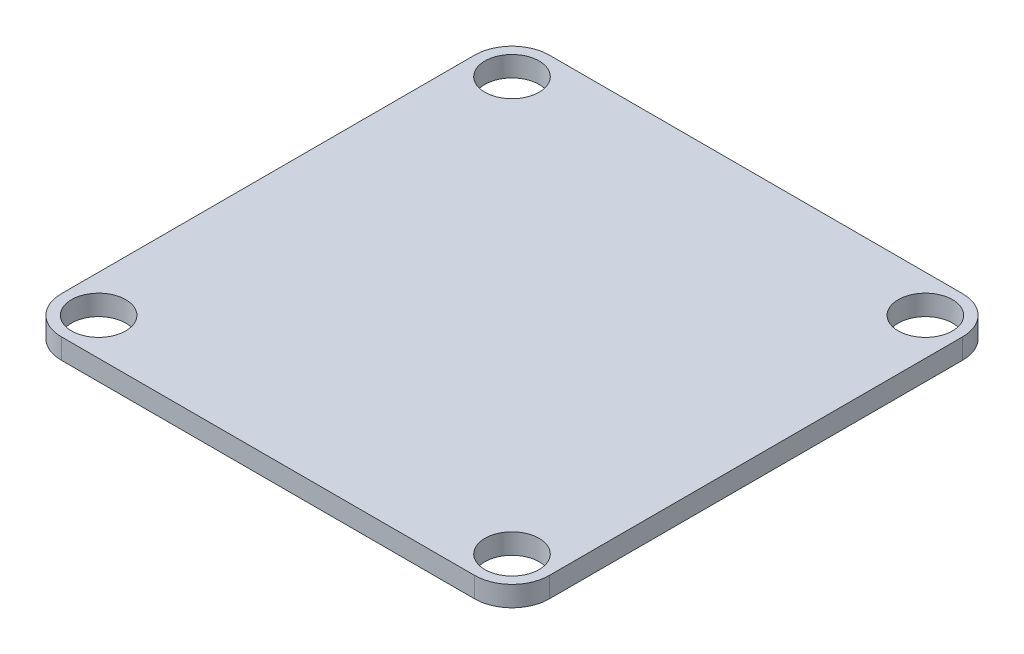
ISO-10303-21;
HEADER;
FILE_DESCRIPTION(('STEP AP214'),'2;1');
FILE_NAME('part.step','',(''),(''),'','','');
FILE_SCHEMA(('AUTOMOTIVE_DESIGN { 1 0 10303 214 1 1 1 1 }'));
ENDSEC;
DATA;
#1=APPLICATION_CONTEXT('core data for automotive mechanical design processes');
#2=APPLICATION_PROTOCOL_DEFINITION('international standard','automotive_design',2000,#1);
#3=PRODUCT_CONTEXT('',#1,'mechanical');
#4=PRODUCT('Part','Part','',(#3));
#5=PRODUCT_RELATED_PRODUCT_CATEGORY('part','',(#4));
#6=PRODUCT_DEFINITION_FORMATION('','',#4);
#7=PRODUCT_DEFINITION_CONTEXT('part definition',#1,'design');
#8=PRODUCT_DEFINITION('design','',#6,#7);
#9=PRODUCT_DEFINITION_SHAPE('','',#8);
#10=(LENGTH_UNIT() NAMED_UNIT(*) SI_UNIT(.MILLI.,.METRE.));
#11=(NAMED_UNIT(*) PLANE_ANGLE_UNIT() SI_UNIT($,.RADIAN.));
#12=(NAMED_UNIT(*) SI_UNIT($,.STERADIAN.) SOLID_ANGLE_UNIT());
#13=UNCERTAINTY_MEASURE_WITH_UNIT(LENGTH_MEASURE(1.E-05),#10,'distance_accuracy_value','');
#14=(GEOMETRIC_REPRESENTATION_CONTEXT(3) GLOBAL_UNCERTAINTY_ASSIGNED_CONTEXT((#13)) GLOBAL_UNIT_ASSIGNED_CONTEXT((#10,
#11,#12)) REPRESENTATION_CONTEXT('',''));
#15=CARTESIAN_POINT('',(0.,0.,0.));
#16=DIRECTION('',(0.,0.,1.));
#17=DIRECTION('',(1.,0.,0.));
#18=AXIS2_PLACEMENT_3D('',#15,#16,#17);
#19=CARTESIAN_POINT('',(15.25,1.5,15.25));
#20=DIRECTION('',(0.,1.,0.));
#21=DIRECTION('',(0.,0.,1.));
#22=AXIS2_PLACEMENT_3D('',#19,#20,#21);
#23=PLANE('',#22);
#24=CARTESIAN_POINT('',(-15.25,1.5,15.25));
#25=DIRECTION('',(0.,1.,0.));
#26=DIRECTION('',(0.,0.,1.));
#27=AXIS2_PLACEMENT_3D('',#24,#25,#26);
#28=CIRCLE('',#27,2.);
#29=CARTESIAN_POINT('',(-15.25,1.5,17.25));
#30=VERTEX_POINT('',#29);
#31=EDGE_CURVE('E193',#30,#30,#28,.T.);
#32=ORIENTED_EDGE('',*,*,#31,.F.);
#33=EDGE_LOOP('',(#32));
#34=FACE_BOUND('',#33,.T.);
#35=CARTESIAN_POINT('',(15.25,1.5,-15.25));
#36=DIRECTION('',(0.,1.,0.));
#37=DIRECTION('',(0.,0.,1.));
#38=AXIS2_PLACEMENT_3D('',#35,#36,#37);
#39=CIRCLE('',#38,2.);
#40=CARTESIAN_POINT('',(15.25,1.5,-13.25));
#41=VERTEX_POINT('',#40);
#42=EDGE_CURVE('E139',#41,#41,#39,.T.);
#43=ORIENTED_EDGE('',*,*,#42,.F.);
#44=EDGE_LOOP('',(#43));
#45=FACE_BOUND('',#44,.T.);
#46=CARTESIAN_POINT('',(15.25,1.5,15.25));
#47=DIRECTION('',(0.,1.,0.));
#48=DIRECTION('',(0.,0.,1.));
#49=AXIS2_PLACEMENT_3D('',#46,#47,#48);
#50=CIRCLE('',#49,2.75);
#51=CARTESIAN_POINT('',(15.25,1.5,18.));
#52=VERTEX_POINT('',#51);
#53=CARTESIAN_POINT('',(18.,1.5,15.25));
#54=VERTEX_POINT('',#53);
#55=EDGE_CURVE('E150',#52,#54,#50,.T.);
#56=ORIENTED_EDGE('',*,*,#55,.T.);
#57=DIRECTION('',(0.,0.,-1.));
#58=VECTOR('',#57,1.);
#59=CARTESIAN_POINT('',(18.,1.5,15.25));
#60=LINE('',#59,#58);
#61=CARTESIAN_POINT('',(18.,1.5,-15.25));
#62=VERTEX_POINT('',#61);
#63=EDGE_CURVE('E98',#54,#62,#60,.T.);
#64=ORIENTED_EDGE('',*,*,#63,.T.);
#65=CARTESIAN_POINT('',(15.25,1.5,-15.25));
#66=DIRECTION('',(0.,1.,0.));
#67=DIRECTION('',(0.,0.,-1.));
#68=AXIS2_PLACEMENT_3D('',#65,#66,#67);
#69=CIRCLE('',#68,2.75);
#70=CARTESIAN_POINT('',(15.25,1.5,-18.));
#71=VERTEX_POINT('',#70);
#72=EDGE_CURVE('E165',#62,#71,#69,.T.);
#73=ORIENTED_EDGE('',*,*,#72,.T.);
#74=DIRECTION('',(-1.,0.,0.));
#75=VECTOR('',#74,1.);
#76=CARTESIAN_POINT('',(-15.25,1.5,-18.));
#77=LINE('',#76,#75);
#78=CARTESIAN_POINT('',(-15.25,1.5,-18.));
#79=VERTEX_POINT('',#78);
#80=EDGE_CURVE('E178',#71,#79,#77,.T.);
#81=ORIENTED_EDGE('',*,*,#80,.T.);
#82=CARTESIAN_POINT('',(-15.25,1.5,-15.25));
#83=DIRECTION('',(0.,1.,0.));
#84=DIRECTION('',(0.,0.,-1.));
#85=AXIS2_PLACEMENT_3D('',#82,#83,#84);
#86=CIRCLE('',#85,2.75);
#87=CARTESIAN_POINT('',(-18.,1.5,-15.25));
#88=VERTEX_POINT('',#87);
#89=EDGE_CURVE('E117',#79,#88,#86,.T.);
#90=ORIENTED_EDGE('',*,*,#89,.T.);
#91=DIRECTION('',(0.,0.,1.));
#92=VECTOR('',#91,1.);
#93=CARTESIAN_POINT('',(-18.,1.5,15.25));
#94=LINE('',#93,#92);
#95=CARTESIAN_POINT('',(-18.,1.5,15.25));
#96=VERTEX_POINT('',#95);
#97=EDGE_CURVE('E111',#88,#96,#94,.T.);
#98=ORIENTED_EDGE('',*,*,#97,.T.);
#99=CARTESIAN_POINT('',(-15.25,1.5,15.25));
#100=DIRECTION('',(0.,1.,0.));
#101=DIRECTION('',(0.,0.,-1.));
#102=AXIS2_PLACEMENT_3D('',#99,#100,#101);
#103=CIRCLE('',#102,2.75);
#104=CARTESIAN_POINT('',(-15.25,1.5,18.));
#105=VERTEX_POINT('',#104);
#106=EDGE_CURVE('E115',#96,#105,#103,.T.);
#107=ORIENTED_EDGE('',*,*,#106,.T.);
#108=DIRECTION('',(1.,0.,0.));
#109=VECTOR('',#108,1.);
#110=CARTESIAN_POINT('',(-15.25,1.5,18.));
#111=LINE('',#110,#109);
#112=EDGE_CURVE('E55',#105,#52,#111,.T.);
#113=ORIENTED_EDGE('',*,*,#112,.T.);
#114=EDGE_LOOP('',(#56,#64,#73,#81,#90,#98,#107,#113));
#115=FACE_BOUND('',#114,.T.);
#116=CARTESIAN_POINT('',(15.25,1.5,15.25));
#117=DIRECTION('',(0.,1.,0.));
#118=DIRECTION('',(0.,0.,1.));
#119=AXIS2_PLACEMENT_3D('',#116,#117,#118);
#120=CIRCLE('',#119,2.);
#121=CARTESIAN_POINT('',(15.25,1.5,17.25));
#122=VERTEX_POINT('',#121);
#123=EDGE_CURVE('E187',#122,#122,#120,.T.);
#124=ORIENTED_EDGE('',*,*,#123,.F.);
#125=EDGE_LOOP('',(#124));
#126=FACE_BOUND('',#125,.T.);
#127=CARTESIAN_POINT('',(-15.25,1.5,-15.25));
#128=DIRECTION('',(0.,1.,0.));
#129=DIRECTION('',(0.,0.,1.));
#130=AXIS2_PLACEMENT_3D('',#127,#128,#129);
#131=CIRCLE('',#130,2.);
#132=CARTESIAN_POINT('',(-15.25,1.5,-13.25));
#133=VERTEX_POINT('',#132);
#134=EDGE_CURVE('E199',#133,#133,#131,.T.);
#135=ORIENTED_EDGE('',*,*,#134,.F.);
#136=EDGE_LOOP('',(#135));
#137=FACE_BOUND('',#136,.T.);
#138=ADVANCED_FACE('F38',(#34,#45,#115,#126,#137),#23,.T.);
#139=CARTESIAN_POINT('',(15.25,0.,15.25));
#140=DIRECTION('',(0.,1.,0.));
#141=DIRECTION('',(0.,0.,1.));
#142=AXIS2_PLACEMENT_3D('',#139,#140,#141);
#143=PLANE('',#142);
#144=CARTESIAN_POINT('',(15.25,0.,15.25));
#145=DIRECTION('',(0.,1.,0.));
#146=DIRECTION('',(0.,0.,1.));
#147=AXIS2_PLACEMENT_3D('',#144,#145,#146);
#148=CIRCLE('',#147,2.75);
#149=CARTESIAN_POINT('',(15.25,0.,18.));
#150=VERTEX_POINT('',#149);
#151=CARTESIAN_POINT('',(18.,0.,15.25));
#152=VERTEX_POINT('',#151);
#153=EDGE_CURVE('E135',#150,#152,#148,.T.);
#154=ORIENTED_EDGE('',*,*,#153,.F.);
#155=DIRECTION('',(1.,0.,0.));
#156=VECTOR('',#155,1.);
#157=CARTESIAN_POINT('',(-15.25,0.,18.));
#158=LINE('',#157,#156);
#159=CARTESIAN_POINT('',(-15.25,0.,18.));
#160=VERTEX_POINT('',#159);
#161=EDGE_CURVE('E90',#160,#150,#158,.T.);
#162=ORIENTED_EDGE('',*,*,#161,.F.);
#163=CARTESIAN_POINT('',(-15.25,0.,15.25));
#164=DIRECTION('',(0.,1.,0.));
#165=DIRECTION('',(0.,0.,-1.));
#166=AXIS2_PLACEMENT_3D('',#163,#164,#165);
#167=CIRCLE('',#166,2.75);
#168=CARTESIAN_POINT('',(-18.,0.,15.25));
#169=VERTEX_POINT('',#168);
#170=EDGE_CURVE('E84',#169,#160,#167,.T.);
#171=ORIENTED_EDGE('',*,*,#170,.F.);
#172=DIRECTION('',(0.,0.,1.));
#173=VECTOR('',#172,1.);
#174=CARTESIAN_POINT('',(-18.,0.,15.25));
#175=LINE('',#174,#173);
#176=CARTESIAN_POINT('',(-18.,0.,-15.25));
#177=VERTEX_POINT('',#176);
#178=EDGE_CURVE('E125',#177,#169,#175,.T.);
#179=ORIENTED_EDGE('',*,*,#178,.F.);
#180=CARTESIAN_POINT('',(-15.25,0.,-15.25));
#181=DIRECTION('',(0.,1.,0.));
#182=DIRECTION('',(0.,0.,-1.));
#183=AXIS2_PLACEMENT_3D('',#180,#181,#182);
#184=CIRCLE('',#183,2.75);
#185=CARTESIAN_POINT('',(-15.25,0.,-18.));
#186=VERTEX_POINT('',#185);
#187=EDGE_CURVE('E145',#186,#177,#184,.T.);
#188=ORIENTED_EDGE('',*,*,#187,.F.);
#189=DIRECTION('',(-1.,0.,0.));
#190=VECTOR('',#189,1.);
#191=CARTESIAN_POINT('',(-15.25,0.,-18.));
#192=LINE('',#191,#190);
#193=CARTESIAN_POINT('',(15.25,0.,-18.));
#194=VERTEX_POINT('',#193);
#195=EDGE_CURVE('E143',#194,#186,#192,.T.);
#196=ORIENTED_EDGE('',*,*,#195,.F.);
#197=CARTESIAN_POINT('',(15.25,0.,-15.25));
#198=DIRECTION('',(0.,1.,0.));
#199=DIRECTION('',(0.,0.,-1.));
#200=AXIS2_PLACEMENT_3D('',#197,#198,#199);
#201=CIRCLE('',#200,2.75);
#202=CARTESIAN_POINT('',(18.,0.,-15.25));
#203=VERTEX_POINT('',#202);
#204=EDGE_CURVE('E141',#203,#194,#201,.T.);
#205=ORIENTED_EDGE('',*,*,#204,.F.);
#206=DIRECTION('',(0.,0.,-1.));
#207=VECTOR('',#206,1.);
#208=CARTESIAN_POINT('',(18.,0.,15.25));
#209=LINE('',#208,#207);
#210=EDGE_CURVE('E138',#152,#203,#209,.T.);
#211=ORIENTED_EDGE('',*,*,#210,.F.);
#212=EDGE_LOOP('',(#154,#162,#171,#179,#188,#196,#205,#211));
#213=FACE_BOUND('',#212,.T.);
#214=CARTESIAN_POINT('',(15.25,0.,-15.25));
#215=DIRECTION('',(0.,1.,0.));
#216=DIRECTION('',(0.,0.,1.));
#217=AXIS2_PLACEMENT_3D('',#214,#215,#216);
#218=CIRCLE('',#217,2.);
#219=CARTESIAN_POINT('',(15.25,0.,-13.25));
#220=VERTEX_POINT('',#219);
#221=EDGE_CURVE('E184',#220,#220,#218,.T.);
#222=ORIENTED_EDGE('',*,*,#221,.T.);
#223=EDGE_LOOP('',(#222));
#224=FACE_BOUND('',#223,.T.);
#225=CARTESIAN_POINT('',(15.25,0.,15.25));
#226=DIRECTION('',(0.,1.,0.));
#227=DIRECTION('',(0.,0.,1.));
#228=AXIS2_PLACEMENT_3D('',#225,#226,#227);
#229=CIRCLE('',#228,2.);
#230=CARTESIAN_POINT('',(15.25,0.,17.25));
#231=VERTEX_POINT('',#230);
#232=EDGE_CURVE('E190',#231,#231,#229,.T.);
#233=ORIENTED_EDGE('',*,*,#232,.T.);
#234=EDGE_LOOP('',(#233));
#235=FACE_BOUND('',#234,.T.);
#236=CARTESIAN_POINT('',(-15.25,0.,15.25));
#237=DIRECTION('',(0.,1.,0.));
#238=DIRECTION('',(0.,0.,1.));
#239=AXIS2_PLACEMENT_3D('',#236,#237,#238);
#240=CIRCLE('',#239,2.);
#241=CARTESIAN_POINT('',(-15.25,0.,17.25));
#242=VERTEX_POINT('',#241);
#243=EDGE_CURVE('E196',#242,#242,#240,.T.);
#244=ORIENTED_EDGE('',*,*,#243,.T.);
#245=EDGE_LOOP('',(#244));
#246=FACE_BOUND('',#245,.T.);
#247=CARTESIAN_POINT('',(-15.25,0.,-15.25));
#248=DIRECTION('',(0.,1.,0.));
#249=DIRECTION('',(0.,0.,1.));
#250=AXIS2_PLACEMENT_3D('',#247,#248,#249);
#251=CIRCLE('',#250,2.);
#252=CARTESIAN_POINT('',(-15.25,0.,-13.25));
#253=VERTEX_POINT('',#252);
#254=EDGE_CURVE('E202',#253,#253,#251,.T.);
#255=ORIENTED_EDGE('',*,*,#254,.T.);
#256=EDGE_LOOP('',(#255));
#257=FACE_BOUND('',#256,.T.);
#258=ADVANCED_FACE('F169',(#213,#224,#235,#246,#257),#143,.F.);
#259=CARTESIAN_POINT('',(15.25,1.5,15.25));
#260=DIRECTION('',(0.,-1.,0.));
#261=DIRECTION('',(0.,0.,-1.));
#262=AXIS2_PLACEMENT_3D('',#259,#260,#261);
#263=CYLINDRICAL_SURFACE('',#262,2.75);
#264=ORIENTED_EDGE('',*,*,#153,.T.);
#265=DIRECTION('',(0.,-1.,0.));
#266=VECTOR('',#265,1.);
#267=CARTESIAN_POINT('',(18.,1.5,15.25));
#268=LINE('',#267,#266);
#269=EDGE_CURVE('E11',#54,#152,#268,.T.);
#270=ORIENTED_EDGE('',*,*,#269,.F.);
#271=ORIENTED_EDGE('',*,*,#55,.F.);
#272=DIRECTION('',(0.,-1.,0.));
#273=VECTOR('',#272,1.);
#274=CARTESIAN_POINT('',(15.25,1.5,18.));
#275=LINE('',#274,#273);
#276=EDGE_CURVE('E131',#52,#150,#275,.T.);
#277=ORIENTED_EDGE('',*,*,#276,.T.);
#278=EDGE_LOOP('',(#264,#270,#271,#277));
#279=FACE_BOUND('',#278,.T.);
#280=ADVANCED_FACE('F40',(#279),#263,.T.);
#281=CARTESIAN_POINT('',(18.,1.5,15.25));
#282=DIRECTION('',(-1.,0.,0.));
#283=DIRECTION('',(0.,0.,1.));
#284=AXIS2_PLACEMENT_3D('',#281,#282,#283);
#285=PLANE('',#284);
#286=ORIENTED_EDGE('',*,*,#210,.T.);
#287=DIRECTION('',(0.,-1.,0.));
#288=VECTOR('',#287,1.);
#289=CARTESIAN_POINT('',(18.,1.5,-15.25));
#290=LINE('',#289,#288);
#291=EDGE_CURVE('E47',#62,#203,#290,.T.);
#292=ORIENTED_EDGE('',*,*,#291,.F.);
#293=ORIENTED_EDGE('',*,*,#63,.F.);
#294=ORIENTED_EDGE('',*,*,#269,.T.);
#295=EDGE_LOOP('',(#286,#292,#293,#294));
#296=FACE_BOUND('',#295,.T.);
#297=ADVANCED_FACE('F236',(#296),#285,.F.);
#298=CARTESIAN_POINT('',(15.25,1.5,-15.25));
#299=DIRECTION('',(0.,-1.,0.));
#300=DIRECTION('',(0.,0.,-1.));
#301=AXIS2_PLACEMENT_3D('',#298,#299,#300);
#302=CYLINDRICAL_SURFACE('',#301,2.75);
#303=ORIENTED_EDGE('',*,*,#204,.T.);
#304=DIRECTION('',(0.,-1.,0.));
#305=VECTOR('',#304,1.);
#306=CARTESIAN_POINT('',(15.25,1.5,-18.));
#307=LINE('',#306,#305);
#308=EDGE_CURVE('E157',#71,#194,#307,.T.);
#309=ORIENTED_EDGE('',*,*,#308,.F.);
#310=ORIENTED_EDGE('',*,*,#72,.F.);
#311=ORIENTED_EDGE('',*,*,#291,.T.);
#312=EDGE_LOOP('',(#303,#309,#310,#311));
#313=FACE_BOUND('',#312,.T.);
#314=ADVANCED_FACE('F163',(#313),#302,.T.);
#315=CARTESIAN_POINT('',(-15.25,1.5,-18.));
#316=DIRECTION('',(0.,0.,1.));
#317=DIRECTION('',(1.,0.,0.));
#318=AXIS2_PLACEMENT_3D('',#315,#316,#317);
#319=PLANE('',#318);
#320=ORIENTED_EDGE('',*,*,#195,.T.);
#321=DIRECTION('',(0.,-1.,0.));
#322=VECTOR('',#321,1.);
#323=CARTESIAN_POINT('',(-15.25,1.5,-18.));
#324=LINE('',#323,#322);
#325=EDGE_CURVE('E154',#79,#186,#324,.T.);
#326=ORIENTED_EDGE('',*,*,#325,.F.);
#327=ORIENTED_EDGE('',*,*,#80,.F.);
#328=ORIENTED_EDGE('',*,*,#308,.T.);
#329=EDGE_LOOP('',(#320,#326,#327,#328));
#330=FACE_BOUND('',#329,.T.);
#331=ADVANCED_FACE('F174',(#330),#319,.F.);
#332=CARTESIAN_POINT('',(-15.25,1.5,-15.25));
#333=DIRECTION('',(0.,-1.,0.));
#334=DIRECTION('',(0.,0.,-1.));
#335=AXIS2_PLACEMENT_3D('',#332,#333,#334);
#336=CYLINDRICAL_SURFACE('',#335,2.75);
#337=ORIENTED_EDGE('',*,*,#187,.T.);
#338=DIRECTION('',(0.,-1.,0.));
#339=VECTOR('',#338,1.);
#340=CARTESIAN_POINT('',(-18.,1.5,-15.25));
#341=LINE('',#340,#339);
#342=EDGE_CURVE('E126',#88,#177,#341,.T.);
#343=ORIENTED_EDGE('',*,*,#342,.F.);
#344=ORIENTED_EDGE('',*,*,#89,.F.);
#345=ORIENTED_EDGE('',*,*,#325,.T.);
#346=EDGE_LOOP('',(#337,#343,#344,#345));
#347=FACE_BOUND('',#346,.T.);
#348=ADVANCED_FACE('F177',(#347),#336,.T.);
#349=CARTESIAN_POINT('',(-18.,1.5,15.25));
#350=DIRECTION('',(1.,0.,0.));
#351=DIRECTION('',(0.,0.,-1.));
#352=AXIS2_PLACEMENT_3D('',#349,#350,#351);
#353=PLANE('',#352);
#354=ORIENTED_EDGE('',*,*,#178,.T.);
#355=DIRECTION('',(0.,-1.,0.));
#356=VECTOR('',#355,1.);
#357=CARTESIAN_POINT('',(-18.,1.5,15.25));
#358=LINE('',#357,#356);
#359=EDGE_CURVE('E122',#96,#169,#358,.T.);
#360=ORIENTED_EDGE('',*,*,#359,.F.);
#361=ORIENTED_EDGE('',*,*,#97,.F.);
#362=ORIENTED_EDGE('',*,*,#342,.T.);
#363=EDGE_LOOP('',(#354,#360,#361,#362));
#364=FACE_BOUND('',#363,.T.);
#365=ADVANCED_FACE('F123',(#364),#353,.F.);
#366=CARTESIAN_POINT('',(-15.25,1.5,15.25));
#367=DIRECTION('',(0.,-1.,0.));
#368=DIRECTION('',(0.,0.,-1.));
#369=AXIS2_PLACEMENT_3D('',#366,#367,#368);
#370=CYLINDRICAL_SURFACE('',#369,2.75);
#371=ORIENTED_EDGE('',*,*,#170,.T.);
#372=DIRECTION('',(0.,-1.,0.));
#373=VECTOR('',#372,1.);
#374=CARTESIAN_POINT('',(-15.25,1.5,18.));
#375=LINE('',#374,#373);
#376=EDGE_CURVE('E127',#105,#160,#375,.T.);
#377=ORIENTED_EDGE('',*,*,#376,.F.);
#378=ORIENTED_EDGE('',*,*,#106,.F.);
#379=ORIENTED_EDGE('',*,*,#359,.T.);
#380=EDGE_LOOP('',(#371,#377,#378,#379));
#381=FACE_BOUND('',#380,.T.);
#382=ADVANCED_FACE('F129',(#381),#370,.T.);
#383=CARTESIAN_POINT('',(-15.25,1.5,18.));
#384=DIRECTION('',(0.,0.,-1.));
#385=DIRECTION('',(-1.,0.,0.));
#386=AXIS2_PLACEMENT_3D('',#383,#384,#385);
#387=PLANE('',#386);
#388=ORIENTED_EDGE('',*,*,#161,.T.);
#389=ORIENTED_EDGE('',*,*,#276,.F.);
#390=ORIENTED_EDGE('',*,*,#112,.F.);
#391=ORIENTED_EDGE('',*,*,#376,.T.);
#392=EDGE_LOOP('',(#388,#389,#390,#391));
#393=FACE_BOUND('',#392,.T.);
#394=ADVANCED_FACE('F224',(#393),#387,.F.);
#395=CARTESIAN_POINT('',(15.25,1.5,-15.25));
#396=DIRECTION('',(0.,-1.,0.));
#397=DIRECTION('',(0.,0.,-1.));
#398=AXIS2_PLACEMENT_3D('',#395,#396,#397);
#399=CYLINDRICAL_SURFACE('',#398,2.);
#400=ORIENTED_EDGE('',*,*,#42,.T.);
#401=EDGE_LOOP('',(#400));
#402=FACE_BOUND('',#401,.T.);
#403=ORIENTED_EDGE('',*,*,#221,.F.);
#404=EDGE_LOOP('',(#403));
#405=FACE_BOUND('',#404,.T.);
#406=ADVANCED_FACE('F221',(#402,#405),#399,.F.);
#407=CARTESIAN_POINT('',(15.25,1.5,15.25));
#408=DIRECTION('',(0.,-1.,0.));
#409=DIRECTION('',(0.,0.,-1.));
#410=AXIS2_PLACEMENT_3D('',#407,#408,#409);
#411=CYLINDRICAL_SURFACE('',#410,2.);
#412=ORIENTED_EDGE('',*,*,#123,.T.);
#413=EDGE_LOOP('',(#412));
#414=FACE_BOUND('',#413,.T.);
#415=ORIENTED_EDGE('',*,*,#232,.F.);
#416=EDGE_LOOP('',(#415));
#417=FACE_BOUND('',#416,.T.);
#418=ADVANCED_FACE('F312',(#414,#417),#411,.F.);
#419=CARTESIAN_POINT('',(-15.25,1.5,15.25));
#420=DIRECTION('',(0.,-1.,0.));
#421=DIRECTION('',(0.,0.,-1.));
#422=AXIS2_PLACEMENT_3D('',#419,#420,#421);
#423=CYLINDRICAL_SURFACE('',#422,2.);
#424=ORIENTED_EDGE('',*,*,#31,.T.);
#425=EDGE_LOOP('',(#424));
#426=FACE_BOUND('',#425,.T.);
#427=ORIENTED_EDGE('',*,*,#243,.F.);
#428=EDGE_LOOP('',(#427));
#429=FACE_BOUND('',#428,.T.);
#430=ADVANCED_FACE('F321',(#426,#429),#423,.F.);
#431=CARTESIAN_POINT('',(-15.25,1.5,-15.25));
#432=DIRECTION('',(0.,-1.,0.));
#433=DIRECTION('',(0.,0.,-1.));
#434=AXIS2_PLACEMENT_3D('',#431,#432,#433);
#435=CYLINDRICAL_SURFACE('',#434,2.);
#436=ORIENTED_EDGE('',*,*,#134,.T.);
#437=EDGE_LOOP('',(#436));
#438=FACE_BOUND('',#437,.T.);
#439=ORIENTED_EDGE('',*,*,#254,.F.);
#440=EDGE_LOOP('',(#439));
#441=FACE_BOUND('',#440,.T.);
#442=ADVANCED_FACE('F208',(#438,#441),#435,.F.);
#443=CLOSED_SHELL('',(#138,#258,#280,#297,#314,#331,#348,#365,#382,#394,#406,#418,#430,#442));
#444=MANIFOLD_SOLID_BREP('B2',#443);
#445=ADVANCED_BREP_SHAPE_REPRESENTATION('',(#18,#444),#14);
#446=SHAPE_DEFINITION_REPRESENTATION(#9,#445);
ENDSEC;
END-ISO-10303-21;
